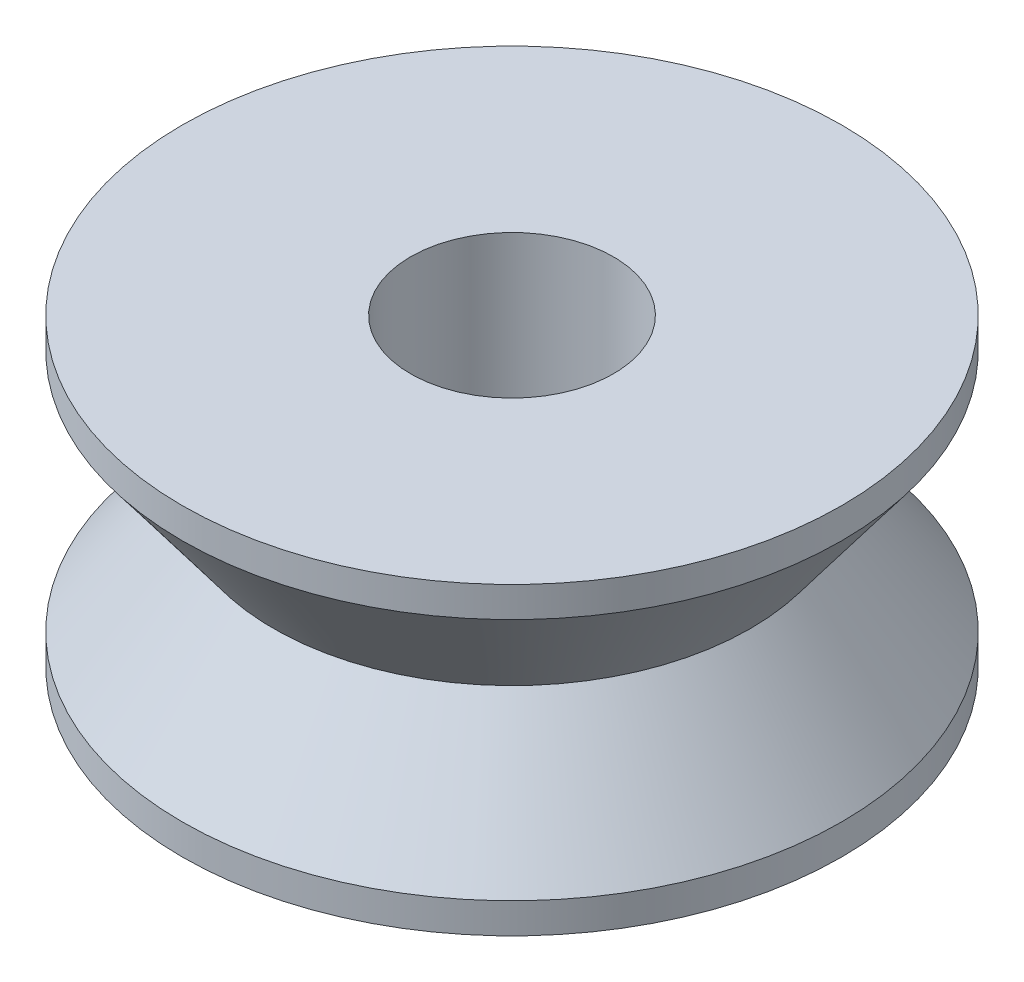
ISO-10303-21;
HEADER;
FILE_DESCRIPTION(('STEP AP214'),'2;1');
FILE_NAME('part.step','',(''),(''),'','','');
FILE_SCHEMA(('AUTOMOTIVE_DESIGN { 1 0 10303 214 1 1 1 1 }'));
ENDSEC;
DATA;
#1=APPLICATION_CONTEXT('core data for automotive mechanical design processes');
#2=APPLICATION_PROTOCOL_DEFINITION('international standard','automotive_design',2000,#1);
#3=PRODUCT_CONTEXT('',#1,'mechanical');
#4=PRODUCT('Part','Part','',(#3));
#5=PRODUCT_RELATED_PRODUCT_CATEGORY('part','',(#4));
#6=PRODUCT_DEFINITION_FORMATION('','',#4);
#7=PRODUCT_DEFINITION_CONTEXT('part definition',#1,'design');
#8=PRODUCT_DEFINITION('design','',#6,#7);
#9=PRODUCT_DEFINITION_SHAPE('','',#8);
#10=(LENGTH_UNIT() NAMED_UNIT(*) SI_UNIT(.MILLI.,.METRE.));
#11=(NAMED_UNIT(*) PLANE_ANGLE_UNIT() SI_UNIT($,.RADIAN.));
#12=(NAMED_UNIT(*) SI_UNIT($,.STERADIAN.) SOLID_ANGLE_UNIT());
#13=UNCERTAINTY_MEASURE_WITH_UNIT(LENGTH_MEASURE(1.E-05),#10,'distance_accuracy_value','');
#14=(GEOMETRIC_REPRESENTATION_CONTEXT(3) GLOBAL_UNCERTAINTY_ASSIGNED_CONTEXT((#13)) GLOBAL_UNIT_ASSIGNED_CONTEXT((#10,
#11,#12)) REPRESENTATION_CONTEXT('',''));
#15=CARTESIAN_POINT('',(0.,0.,0.));
#16=DIRECTION('',(0.,0.,1.));
#17=DIRECTION('',(1.,0.,0.));
#18=AXIS2_PLACEMENT_3D('',#15,#16,#17);
#19=CARTESIAN_POINT('',(0.,0.,0.));
#20=DIRECTION('',(0.,-1.,0.));
#21=DIRECTION('',(1.,0.,0.));
#22=AXIS2_PLACEMENT_3D('',#19,#20,#21);
#23=CONICAL_SURFACE('',#22,4.7,0.643501108793284);
#24=CARTESIAN_POINT('',(0.,-2.4,0.));
#25=DIRECTION('',(0.,-1.,0.));
#26=DIRECTION('',(1.,0.,0.));
#27=AXIS2_PLACEMENT_3D('',#24,#25,#26);
#28=CIRCLE('',#27,6.5);
#29=CARTESIAN_POINT('',(6.5,-2.4,0.));
#30=VERTEX_POINT('',#29);
#31=EDGE_CURVE('E56',#30,#30,#28,.T.);
#32=ORIENTED_EDGE('',*,*,#31,.F.);
#33=EDGE_LOOP('',(#32));
#34=FACE_BOUND('',#33,.T.);
#35=CARTESIAN_POINT('',(0.,0.,0.));
#36=DIRECTION('',(0.,-1.,0.));
#37=DIRECTION('',(1.,0.,0.));
#38=AXIS2_PLACEMENT_3D('',#35,#36,#37);
#39=CIRCLE('',#38,4.7);
#40=CARTESIAN_POINT('',(4.7,0.,0.));
#41=VERTEX_POINT('',#40);
#42=EDGE_CURVE('E10',#41,#41,#39,.T.);
#43=ORIENTED_EDGE('',*,*,#42,.T.);
#44=EDGE_LOOP('',(#43));
#45=FACE_BOUND('',#44,.T.);
#46=ADVANCED_FACE('F37',(#34,#45),#23,.T.);
#47=CARTESIAN_POINT('',(0.,2.4,0.));
#48=DIRECTION('',(0.,1.,0.));
#49=DIRECTION('',(-1.,0.,0.));
#50=AXIS2_PLACEMENT_3D('',#47,#48,#49);
#51=CONICAL_SURFACE('',#50,6.5,0.643501108793284);
#52=ORIENTED_EDGE('',*,*,#42,.F.);
#53=EDGE_LOOP('',(#52));
#54=FACE_BOUND('',#53,.T.);
#55=CARTESIAN_POINT('',(0.,2.4,0.));
#56=DIRECTION('',(0.,-1.,0.));
#57=DIRECTION('',(1.,0.,0.));
#58=AXIS2_PLACEMENT_3D('',#55,#56,#57);
#59=CIRCLE('',#58,6.5);
#60=CARTESIAN_POINT('',(6.5,2.4,0.));
#61=VERTEX_POINT('',#60);
#62=EDGE_CURVE('E44',#61,#61,#59,.T.);
#63=ORIENTED_EDGE('',*,*,#62,.T.);
#64=EDGE_LOOP('',(#63));
#65=FACE_BOUND('',#64,.T.);
#66=ADVANCED_FACE('F86',(#54,#65),#51,.T.);
#67=CARTESIAN_POINT('',(0.,-3.,0.));
#68=DIRECTION('',(0.,-1.,0.));
#69=DIRECTION('',(1.,0.,0.));
#70=AXIS2_PLACEMENT_3D('',#67,#68,#69);
#71=CYLINDRICAL_SURFACE('',#70,6.5);
#72=ORIENTED_EDGE('',*,*,#62,.F.);
#73=EDGE_LOOP('',(#72));
#74=FACE_BOUND('',#73,.T.);
#75=CARTESIAN_POINT('',(0.,3.,0.));
#76=DIRECTION('',(0.,-1.,0.));
#77=DIRECTION('',(1.,0.,0.));
#78=AXIS2_PLACEMENT_3D('',#75,#76,#77);
#79=CIRCLE('',#78,6.5);
#80=CARTESIAN_POINT('',(6.5,3.,0.));
#81=VERTEX_POINT('',#80);
#82=EDGE_CURVE('E48',#81,#81,#79,.T.);
#83=ORIENTED_EDGE('',*,*,#82,.T.);
#84=EDGE_LOOP('',(#83));
#85=FACE_BOUND('',#84,.T.);
#86=ADVANCED_FACE('F91',(#74,#85),#71,.T.);
#87=CARTESIAN_POINT('',(0.,3.,0.));
#88=DIRECTION('',(0.,-1.,0.));
#89=DIRECTION('',(1.,0.,0.));
#90=AXIS2_PLACEMENT_3D('',#87,#88,#89);
#91=PLANE('',#90);
#92=CARTESIAN_POINT('',(0.,3.,0.));
#93=DIRECTION('',(0.,1.,0.));
#94=DIRECTION('',(-1.,0.,0.));
#95=AXIS2_PLACEMENT_3D('',#92,#93,#94);
#96=CIRCLE('',#95,2.);
#97=CARTESIAN_POINT('',(-2.,3.,0.));
#98=VERTEX_POINT('',#97);
#99=EDGE_CURVE('E59',#98,#98,#96,.T.);
#100=ORIENTED_EDGE('',*,*,#99,.F.);
#101=EDGE_LOOP('',(#100));
#102=FACE_BOUND('',#101,.T.);
#103=ORIENTED_EDGE('',*,*,#82,.F.);
#104=EDGE_LOOP('',(#103));
#105=FACE_BOUND('',#104,.T.);
#106=ADVANCED_FACE('F72',(#102,#105),#91,.F.);
#107=CARTESIAN_POINT('',(0.,-3.,0.));
#108=DIRECTION('',(0.,-1.,0.));
#109=DIRECTION('',(1.,0.,0.));
#110=AXIS2_PLACEMENT_3D('',#107,#108,#109);
#111=PLANE('',#110);
#112=CARTESIAN_POINT('',(0.,-3.,0.));
#113=DIRECTION('',(0.,-1.,0.));
#114=DIRECTION('',(1.,0.,0.));
#115=AXIS2_PLACEMENT_3D('',#112,#113,#114);
#116=CIRCLE('',#115,2.);
#117=CARTESIAN_POINT('',(2.,-3.,0.));
#118=VERTEX_POINT('',#117);
#119=EDGE_CURVE('E40',#118,#118,#116,.T.);
#120=ORIENTED_EDGE('',*,*,#119,.F.);
#121=EDGE_LOOP('',(#120));
#122=FACE_BOUND('',#121,.T.);
#123=CARTESIAN_POINT('',(0.,-3.,0.));
#124=DIRECTION('',(0.,-1.,0.));
#125=DIRECTION('',(1.,0.,0.));
#126=AXIS2_PLACEMENT_3D('',#123,#124,#125);
#127=CIRCLE('',#126,6.5);
#128=CARTESIAN_POINT('',(6.5,-3.,0.));
#129=VERTEX_POINT('',#128);
#130=EDGE_CURVE('E53',#129,#129,#127,.T.);
#131=ORIENTED_EDGE('',*,*,#130,.T.);
#132=EDGE_LOOP('',(#131));
#133=FACE_BOUND('',#132,.T.);
#134=ADVANCED_FACE('F68',(#122,#133),#111,.T.);
#135=CARTESIAN_POINT('',(0.,-3.,0.));
#136=DIRECTION('',(0.,-1.,0.));
#137=DIRECTION('',(1.,0.,0.));
#138=AXIS2_PLACEMENT_3D('',#135,#136,#137);
#139=CYLINDRICAL_SURFACE('',#138,6.5);
#140=ORIENTED_EDGE('',*,*,#31,.T.);
#141=EDGE_LOOP('',(#140));
#142=FACE_BOUND('',#141,.T.);
#143=ORIENTED_EDGE('',*,*,#130,.F.);
#144=EDGE_LOOP('',(#143));
#145=FACE_BOUND('',#144,.T.);
#146=ADVANCED_FACE('F71',(#142,#145),#139,.T.);
#147=CARTESIAN_POINT('',(0.,-7.,0.));
#148=DIRECTION('',(0.,1.,0.));
#149=DIRECTION('',(-1.,0.,0.));
#150=AXIS2_PLACEMENT_3D('',#147,#148,#149);
#151=CYLINDRICAL_SURFACE('',#150,2.);
#152=ORIENTED_EDGE('',*,*,#119,.T.);
#153=EDGE_LOOP('',(#152));
#154=FACE_BOUND('',#153,.T.);
#155=ORIENTED_EDGE('',*,*,#99,.T.);
#156=EDGE_LOOP('',(#155));
#157=FACE_BOUND('',#156,.T.);
#158=ADVANCED_FACE('F66',(#154,#157),#151,.F.);
#159=CLOSED_SHELL('',(#46,#66,#86,#106,#134,#146,#158));
#160=MANIFOLD_SOLID_BREP('B2',#159);
#161=ADVANCED_BREP_SHAPE_REPRESENTATION('',(#18,#160),#14);
#162=SHAPE_DEFINITION_REPRESENTATION(#9,#161);
ENDSEC;
END-ISO-10303-21;
